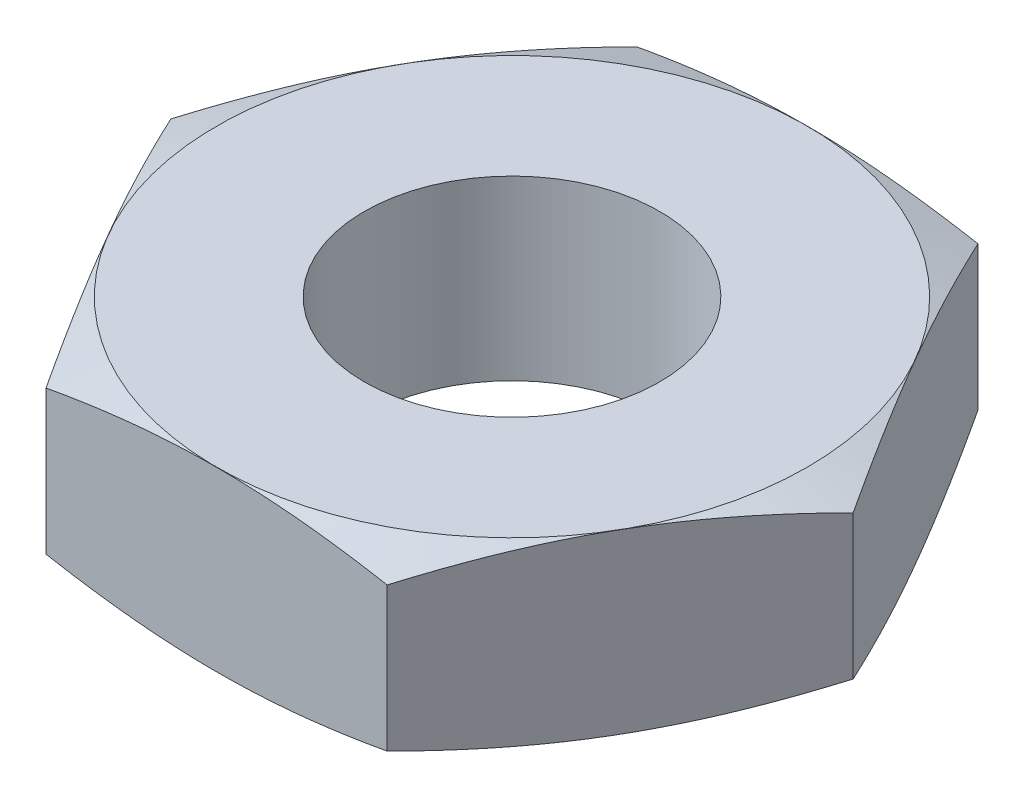
ISO-10303-21;
HEADER;
FILE_DESCRIPTION(('STEP AP214'),'2;1');
FILE_NAME('part.step','',(''),(''),'','','');
FILE_SCHEMA(('AUTOMOTIVE_DESIGN { 1 0 10303 214 1 1 1 1 }'));
ENDSEC;
DATA;
#1=APPLICATION_CONTEXT('core data for automotive mechanical design processes');
#2=APPLICATION_PROTOCOL_DEFINITION('international standard','automotive_design',2000,#1);
#3=PRODUCT_CONTEXT('',#1,'mechanical');
#4=PRODUCT('Part','Part','',(#3));
#5=PRODUCT_RELATED_PRODUCT_CATEGORY('part','',(#4));
#6=PRODUCT_DEFINITION_FORMATION('','',#4);
#7=PRODUCT_DEFINITION_CONTEXT('part definition',#1,'design');
#8=PRODUCT_DEFINITION('design','',#6,#7);
#9=PRODUCT_DEFINITION_SHAPE('','',#8);
#10=(LENGTH_UNIT() NAMED_UNIT(*) SI_UNIT(.MILLI.,.METRE.));
#11=(NAMED_UNIT(*) PLANE_ANGLE_UNIT() SI_UNIT($,.RADIAN.));
#12=(NAMED_UNIT(*) SI_UNIT($,.STERADIAN.) SOLID_ANGLE_UNIT());
#13=UNCERTAINTY_MEASURE_WITH_UNIT(LENGTH_MEASURE(1.E-05),#10,'distance_accuracy_value','');
#14=(GEOMETRIC_REPRESENTATION_CONTEXT(3) GLOBAL_UNCERTAINTY_ASSIGNED_CONTEXT((#13)) GLOBAL_UNIT_ASSIGNED_CONTEXT((#10,
#11,#12)) REPRESENTATION_CONTEXT('',''));
#15=CARTESIAN_POINT('',(0.,0.,0.));
#16=DIRECTION('',(0.,0.,1.));
#17=DIRECTION('',(1.,0.,0.));
#18=AXIS2_PLACEMENT_3D('',#15,#16,#17);
#19=CARTESIAN_POINT('',(0.,0.6,0.));
#20=DIRECTION('',(0.,1.,0.));
#21=DIRECTION('',(0.,0.,1.));
#22=AXIS2_PLACEMENT_3D('',#19,#20,#21);
#23=PLANE('',#22);
#24=CARTESIAN_POINT('',(0.,0.6,0.));
#25=DIRECTION('',(0.,1.,0.));
#26=DIRECTION('',(0.,0.,1.));
#27=AXIS2_PLACEMENT_3D('',#24,#25,#26);
#28=CIRCLE('',#27,1.);
#29=CARTESIAN_POINT('',(0.,0.6,1.));
#30=VERTEX_POINT('',#29);
#31=EDGE_CURVE('E191',#30,#30,#28,.T.);
#32=ORIENTED_EDGE('',*,*,#31,.F.);
#33=EDGE_LOOP('',(#32));
#34=FACE_BOUND('',#33,.T.);
#35=CARTESIAN_POINT('',(0.,0.6,0.));
#36=DIRECTION('',(0.,-1.,0.));
#37=DIRECTION('',(1.,0.,0.));
#38=AXIS2_PLACEMENT_3D('',#35,#36,#37);
#39=CIRCLE('',#38,1.9994010767585);
#40=CARTESIAN_POINT('',(1.9994010767585,0.6,0.));
#41=VERTEX_POINT('',#40);
#42=EDGE_CURVE('E212',#41,#41,#39,.T.);
#43=ORIENTED_EDGE('',*,*,#42,.F.);
#44=EDGE_LOOP('',(#43));
#45=FACE_BOUND('',#44,.T.);
#46=ADVANCED_FACE('F33',(#34,#45),#23,.T.);
#47=CARTESIAN_POINT('',(0.,-0.6,0.));
#48=DIRECTION('',(0.,1.,0.));
#49=DIRECTION('',(0.,0.,1.));
#50=AXIS2_PLACEMENT_3D('',#47,#48,#49);
#51=PLANE('',#50);
#52=CARTESIAN_POINT('',(0.,-0.6,0.));
#53=DIRECTION('',(0.,1.,0.));
#54=DIRECTION('',(0.,0.,1.));
#55=AXIS2_PLACEMENT_3D('',#52,#53,#54);
#56=CIRCLE('',#55,1.);
#57=CARTESIAN_POINT('',(0.,-0.6,1.));
#58=VERTEX_POINT('',#57);
#59=EDGE_CURVE('E190',#58,#58,#56,.T.);
#60=ORIENTED_EDGE('',*,*,#59,.T.);
#61=EDGE_LOOP('',(#60));
#62=FACE_BOUND('',#61,.T.);
#63=CARTESIAN_POINT('',(0.,-0.600000000000001,0.));
#64=DIRECTION('',(0.,-1.,0.));
#65=DIRECTION('',(1.,0.,0.));
#66=AXIS2_PLACEMENT_3D('',#63,#64,#65);
#67=CIRCLE('',#66,1.9994010767585);
#68=CARTESIAN_POINT('',(1.9994010767585,-0.600000000000001,0.));
#69=VERTEX_POINT('',#68);
#70=EDGE_CURVE('E215',#69,#69,#67,.T.);
#71=ORIENTED_EDGE('',*,*,#70,.T.);
#72=EDGE_LOOP('',(#71));
#73=FACE_BOUND('',#72,.T.);
#74=ADVANCED_FACE('F222',(#62,#73),#51,.F.);
#75=CARTESIAN_POINT('',(0.,0.6,0.));
#76=DIRECTION('',(0.,-1.,0.));
#77=DIRECTION('',(0.,0.,-1.));
#78=AXIS2_PLACEMENT_3D('',#75,#76,#77);
#79=CYLINDRICAL_SURFACE('',#78,1.);
#80=ORIENTED_EDGE('',*,*,#31,.T.);
#81=EDGE_LOOP('',(#80));
#82=FACE_BOUND('',#81,.T.);
#83=ORIENTED_EDGE('',*,*,#59,.F.);
#84=EDGE_LOOP('',(#83));
#85=FACE_BOUND('',#84,.T.);
#86=ADVANCED_FACE('F128',(#82,#85),#79,.F.);
#87=CARTESIAN_POINT('',(0.,-0.600000000000001,0.));
#88=DIRECTION('',(0.,1.,0.));
#89=DIRECTION('',(-1.,0.,0.));
#90=AXIS2_PLACEMENT_3D('',#87,#88,#89);
#91=CONICAL_SURFACE('',#90,1.9994010767585,1.22173047639604);
#92=ORIENTED_EDGE('',*,*,#70,.F.);
#93=EDGE_LOOP('',(#92));
#94=FACE_BOUND('',#93,.T.);
#95=CARTESIAN_POINT('',(2.30951654681234,-0.487127196563017,-0.00020000000000341));
#96=CARTESIAN_POINT('',(2.26168836191613,-0.504543559167057,0.0826408462740292));
#97=CARTESIAN_POINT('',(2.213702437291,-0.520386892866488,0.165754905772931));
#98=CARTESIAN_POINT('',(2.11741850917833,-0.548260956120586,0.332523561216387));
#99=CARTESIAN_POINT('',(2.06912029137895,-0.560288700830407,0.41617852835994));
#100=CARTESIAN_POINT('',(1.97274789994999,-0.579743294111881,0.583100406761805));
#101=CARTESIAN_POINT('',(1.92467592830622,-0.587212585445252,0.666363504068832));
#102=CARTESIAN_POINT('',(1.82841954097686,-0.597231020361229,0.833084457476312));
#103=CARTESIAN_POINT('',(1.78023517427287,-0.599782009767486,0.916542228738155));
#104=CARTESIAN_POINT('',(1.68386644086488,-0.599782009767486,1.08345777126184));
#105=CARTESIAN_POINT('',(1.63568207416089,-0.597231020361229,1.16691554252368));
#106=CARTESIAN_POINT('',(1.53942568683153,-0.587212585445252,1.33363649593116));
#107=CARTESIAN_POINT('',(1.49135371518776,-0.57974329411188,1.41689959323819));
#108=CARTESIAN_POINT('',(1.39498132375881,-0.560288700830407,1.58382147164006));
#109=CARTESIAN_POINT('',(1.34668310595943,-0.548260956120585,1.66747643878361));
#110=CARTESIAN_POINT('',(1.25039917784676,-0.520386892866488,1.83424509422707));
#111=CARTESIAN_POINT('',(1.20241325322162,-0.504543559167056,1.91735915372597));
#112=CARTESIAN_POINT('',(1.15458506832541,-0.487127196563017,2.0002));
#113=B_SPLINE_CURVE_WITH_KNOTS('',3,(#95,#96,#97,#98,#99,#100,#101,#102,#103,#104,#105,#106,
#107,#108,#109,#110,#111,#112),.UNSPECIFIED.,.F.,.F.,(4,2,2,2,2,2,2,2,4),(0.,0.291716985835479,
0.583661615412809,0.872844804843115,1.16191944356589,1.45099408228865,1.74017727171896,
2.03212190129629,2.32383888713177),.UNSPECIFIED.);
#114=CARTESIAN_POINT('',(2.3094010767585,-0.487169227377481,0.));
#115=VERTEX_POINT('',#114);
#116=CARTESIAN_POINT('',(1.15470053837925,-0.48716922737748,2.));
#117=VERTEX_POINT('',#116);
#118=EDGE_CURVE('E62',#115,#117,#113,.T.);
#119=ORIENTED_EDGE('',*,*,#118,.T.);
#120=CARTESIAN_POINT('',(3.46705626768987,0.129089886549738,2.));
#121=CARTESIAN_POINT('',(3.33013884554599,0.0859548917896651,2.));
#122=CARTESIAN_POINT('',(3.19304996881433,0.0433440823684922,2.));
#123=CARTESIAN_POINT('',(2.91836561650236,-0.0403259218189088,2.));
#124=CARTESIAN_POINT('',(2.78077003017304,-0.0813847521993045,2.));
#125=CARTESIAN_POINT('',(2.50293989343281,-0.162016803843045,2.));
#126=CARTESIAN_POINT('',(2.36269633792908,-0.201559209946393,2.));
#127=CARTESIAN_POINT('',(2.08140003417142,-0.277660490936854,2.));
#128=CARTESIAN_POINT('',(1.94034731693318,-0.314219479373179,2.));
#129=CARTESIAN_POINT('',(1.66324364687404,-0.381664102501102,2.));
#130=CARTESIAN_POINT('',(1.52723594652576,-0.41272520398333,2.));
#131=CARTESIAN_POINT('',(1.25407218618375,-0.469483257568481,2.));
#132=CARTESIAN_POINT('',(1.11691604976117,-0.495179849662369,2.));
#133=CARTESIAN_POINT('',(0.842472176170576,-0.539097359435634,2.));
#134=CARTESIAN_POINT('',(0.705193739633208,-0.55737480415698,2.));
#135=CARTESIAN_POINT('',(0.429720168506988,-0.584722819504035,2.));
#136=CARTESIAN_POINT('',(0.291525372840955,-0.59379662175013,2.));
#137=CARTESIAN_POINT('',(0.0779284525007091,-0.59974611879544,2.));
#138=CARTESIAN_POINT('',(0.00261695760709193,-0.60029666122611,2.));
#139=CARTESIAN_POINT('',(-0.147965758277367,-0.598306508523819,2.));
#140=CARTESIAN_POINT('',(-0.223236978738911,-0.595765773716477,2.));
#141=CARTESIAN_POINT('',(-0.448841700044504,-0.58363542280208,2.));
#142=CARTESIAN_POINT('',(-0.598944755271522,-0.569537100020046,2.));
#143=CARTESIAN_POINT('',(-0.899076036855468,-0.531279295709715,2.));
#144=CARTESIAN_POINT('',(-1.04909293533219,-0.507035887426858,2.));
#145=CARTESIAN_POINT('',(-1.34772186103745,-0.451170901378118,2.));
#146=CARTESIAN_POINT('',(-1.49633376856316,-0.419548700742286,2.));
#147=CARTESIAN_POINT('',(-1.79945714467584,-0.349483573797011,2.));
#148=CARTESIAN_POINT('',(-1.95390856215991,-0.310785736524934,2.));
#149=CARTESIAN_POINT('',(-2.26176733214314,-0.22949658984245,2.));
#150=CARTESIAN_POINT('',(-2.41517470355086,-0.186905351147568,2.));
#151=CARTESIAN_POINT('',(-2.71866034008922,-0.0997598798531306,2.));
#152=CARTESIAN_POINT('',(-2.86875149851782,-0.0552501542070376,2.));
#153=CARTESIAN_POINT('',(-3.16831402385208,0.0356674807842536,2.));
#154=CARTESIAN_POINT('',(-3.31778555079943,0.0820748613624075,2.));
#155=CARTESIAN_POINT('',(-3.46705626768987,0.129089886549739,2.));
#156=B_SPLINE_CURVE_WITH_KNOTS('',3,(#120,#121,#122,#123,#124,#125,#126,#127,#128,#129,#130,
#131,#132,#133,#134,#135,#136,#137,#138,#139,#140,#141,#142,#143,#144,#145,#146,#147,#148,#149,
#150,#151,#152,#153,#154,#155),.UNSPECIFIED.,.F.,.F.,(4,2,2,2,2,2,2,2,2,2,2,2,2,2,2,2,2,4),(0.,
0.430662284693181,0.861425063416365,1.29853673075301,1.73563175380379,2.15408469534232,
2.57256570998792,2.9877955748489,3.4028795919872,3.62876136808668,3.85464604325127,
4.30647973356047,4.76212758322337,5.21781390965536,5.69541820539945,6.1730138281794,
6.64265524446317,7.11216667877014),.UNSPECIFIED.);
#157=CARTESIAN_POINT('',(-1.15470053837925,-0.48716922737748,2.));
#158=VERTEX_POINT('',#157);
#159=EDGE_CURVE('E48',#117,#158,#156,.T.);
#160=ORIENTED_EDGE('',*,*,#159,.T.);
#161=CARTESIAN_POINT('',(-1.15458506832541,-0.487127196563017,2.0002));
#162=CARTESIAN_POINT('',(-1.20241325322162,-0.504543559167056,1.91735915372597));
#163=CARTESIAN_POINT('',(-1.25039917784675,-0.520386892866487,1.83424509422707));
#164=CARTESIAN_POINT('',(-1.34668310595942,-0.548260956120585,1.66747643878361));
#165=CARTESIAN_POINT('',(-1.3949813237588,-0.560288700830406,1.58382147164006));
#166=CARTESIAN_POINT('',(-1.49135371518776,-0.57974329411188,1.41689959323819));
#167=CARTESIAN_POINT('',(-1.53942568683153,-0.587212585445252,1.33363649593117));
#168=CARTESIAN_POINT('',(-1.63568207416089,-0.597231020361229,1.16691554252369));
#169=CARTESIAN_POINT('',(-1.68386644086488,-0.599782009767485,1.08345777126184));
#170=CARTESIAN_POINT('',(-1.78023517427287,-0.599782009767485,0.916542228738158));
#171=CARTESIAN_POINT('',(-1.82841954097686,-0.597231020361229,0.833084457476316));
#172=CARTESIAN_POINT('',(-1.92467592830622,-0.587212585445252,0.666363504068835));
#173=CARTESIAN_POINT('',(-1.97274789994999,-0.57974329411188,0.583100406761808));
#174=CARTESIAN_POINT('',(-2.06912029137895,-0.560288700830406,0.416178528359943));
#175=CARTESIAN_POINT('',(-2.11741850917833,-0.548260956120585,0.332523561216391));
#176=CARTESIAN_POINT('',(-2.213702437291,-0.520386892866487,0.165754905772936));
#177=CARTESIAN_POINT('',(-2.26168836191613,-0.504543559167056,0.082640846274034));
#178=CARTESIAN_POINT('',(-2.30951654681234,-0.487127196563017,-0.000199999999998725));
#179=B_SPLINE_CURVE_WITH_KNOTS('',3,(#161,#162,#163,#164,#165,#166,#167,#168,#169,#170,#171,
#172,#173,#174,#175,#176,#177,#178),.UNSPECIFIED.,.F.,.F.,(4,2,2,2,2,2,2,2,4),(0.,
0.291716985835479,0.583661615412808,0.872844804843114,1.16191944356588,1.45099408228865,
1.74017727171896,2.03212190129629,2.32383888713177),.UNSPECIFIED.);
#180=CARTESIAN_POINT('',(-2.3094010767585,-0.48716922737748,0.));
#181=VERTEX_POINT('',#180);
#182=EDGE_CURVE('E137',#158,#181,#179,.T.);
#183=ORIENTED_EDGE('',*,*,#182,.T.);
#184=CARTESIAN_POINT('',(-2.30951654681234,-0.487127196563017,0.000200000000001812));
#185=CARTESIAN_POINT('',(-2.26168836191613,-0.504543559167056,-0.0826408462740309));
#186=CARTESIAN_POINT('',(-2.213702437291,-0.520386892866488,-0.165754905772933));
#187=CARTESIAN_POINT('',(-2.11741850917833,-0.548260956120585,-0.332523561216388));
#188=CARTESIAN_POINT('',(-2.06912029137895,-0.560288700830407,-0.416178528359941));
#189=CARTESIAN_POINT('',(-1.97274789994999,-0.57974329411188,-0.583100406761806));
#190=CARTESIAN_POINT('',(-1.92467592830622,-0.587212585445252,-0.666363504068833));
#191=CARTESIAN_POINT('',(-1.82841954097686,-0.597231020361229,-0.833084457476314));
#192=CARTESIAN_POINT('',(-1.78023517427287,-0.599782009767486,-0.916542228738156));
#193=CARTESIAN_POINT('',(-1.68386644086488,-0.599782009767486,-1.08345777126184));
#194=CARTESIAN_POINT('',(-1.63568207416089,-0.597231020361229,-1.16691554252369));
#195=CARTESIAN_POINT('',(-1.53942568683153,-0.587212585445252,-1.33363649593117));
#196=CARTESIAN_POINT('',(-1.49135371518776,-0.57974329411188,-1.41689959323819));
#197=CARTESIAN_POINT('',(-1.3949813237588,-0.560288700830406,-1.58382147164006));
#198=CARTESIAN_POINT('',(-1.34668310595943,-0.548260956120585,-1.66747643878361));
#199=CARTESIAN_POINT('',(-1.25039917784675,-0.520386892866487,-1.83424509422707));
#200=CARTESIAN_POINT('',(-1.20241325322162,-0.504543559167056,-1.91735915372597));
#201=CARTESIAN_POINT('',(-1.15458506832541,-0.487127196563017,-2.0002));
#202=B_SPLINE_CURVE_WITH_KNOTS('',3,(#184,#185,#186,#187,#188,#189,#190,#191,#192,#193,#194,
#195,#196,#197,#198,#199,#200,#201),.UNSPECIFIED.,.F.,.F.,(4,2,2,2,2,2,2,2,4),(0.,
0.291716985835479,0.583661615412809,0.872844804843115,1.16191944356588,1.45099408228865,
1.74017727171896,2.03212190129629,2.32383888713177),.UNSPECIFIED.);
#203=CARTESIAN_POINT('',(-1.15470053837925,-0.48716922737748,-2.));
#204=VERTEX_POINT('',#203);
#205=EDGE_CURVE('E145',#181,#204,#202,.T.);
#206=ORIENTED_EDGE('',*,*,#205,.T.);
#207=CARTESIAN_POINT('',(-3.46705626768987,0.12908988654974,-2.));
#208=CARTESIAN_POINT('',(-3.33013884554599,0.0859548917896662,-2.));
#209=CARTESIAN_POINT('',(-3.19304996881433,0.0433440823684932,-2.));
#210=CARTESIAN_POINT('',(-2.91836561650236,-0.0403259218189079,-2.));
#211=CARTESIAN_POINT('',(-2.78077003017305,-0.0813847521993036,-2.));
#212=CARTESIAN_POINT('',(-2.50293989343281,-0.162016803843044,-2.));
#213=CARTESIAN_POINT('',(-2.36269633792908,-0.201559209946392,-2.));
#214=CARTESIAN_POINT('',(-2.08140003417142,-0.277660490936854,-2.));
#215=CARTESIAN_POINT('',(-1.94034731693318,-0.314219479373179,-2.));
#216=CARTESIAN_POINT('',(-1.66324364687404,-0.381664102501101,-2.));
#217=CARTESIAN_POINT('',(-1.52723594652576,-0.41272520398333,-2.));
#218=CARTESIAN_POINT('',(-1.25407218618375,-0.469483257568481,-2.));
#219=CARTESIAN_POINT('',(-1.11691604976117,-0.495179849662369,-2.));
#220=CARTESIAN_POINT('',(-0.842472176170575,-0.539097359435634,-2.));
#221=CARTESIAN_POINT('',(-0.705193739633208,-0.557374804156979,-2.));
#222=CARTESIAN_POINT('',(-0.429720168506987,-0.584722819504035,-2.));
#223=CARTESIAN_POINT('',(-0.291525372840954,-0.59379662175013,-2.));
#224=CARTESIAN_POINT('',(-0.0779284525007085,-0.59974611879544,-2.));
#225=CARTESIAN_POINT('',(-0.0026169576070914,-0.60029666122611,-2.));
#226=CARTESIAN_POINT('',(0.147965758277368,-0.598306508523819,-2.));
#227=CARTESIAN_POINT('',(0.223236978738912,-0.595765773716477,-2.));
#228=CARTESIAN_POINT('',(0.448841700044505,-0.58363542280208,-2.));
#229=CARTESIAN_POINT('',(0.598944755271523,-0.569537100020046,-2.));
#230=CARTESIAN_POINT('',(0.899076036855469,-0.531279295709715,-2.));
#231=CARTESIAN_POINT('',(1.04909293533219,-0.507035887426858,-2.));
#232=CARTESIAN_POINT('',(1.34772186103745,-0.451170901378119,-2.));
#233=CARTESIAN_POINT('',(1.49633376856316,-0.419548700742286,-2.));
#234=CARTESIAN_POINT('',(1.79945714467585,-0.349483573797011,-2.));
#235=CARTESIAN_POINT('',(1.95390856215992,-0.310785736524934,-2.));
#236=CARTESIAN_POINT('',(2.26176733214314,-0.22949658984245,-2.));
#237=CARTESIAN_POINT('',(2.41517470355086,-0.186905351147568,-2.));
#238=CARTESIAN_POINT('',(2.71866034008922,-0.0997598798531305,-2.));
#239=CARTESIAN_POINT('',(2.86875149851782,-0.0552501542070375,-2.));
#240=CARTESIAN_POINT('',(3.16831402385208,0.0356674807842535,-2.));
#241=CARTESIAN_POINT('',(3.31778555079943,0.0820748613624073,-2.));
#242=CARTESIAN_POINT('',(3.46705626768987,0.129089886549739,-2.));
#243=B_SPLINE_CURVE_WITH_KNOTS('',3,(#207,#208,#209,#210,#211,#212,#213,#214,#215,#216,#217,
#218,#219,#220,#221,#222,#223,#224,#225,#226,#227,#228,#229,#230,#231,#232,#233,#234,#235,#236,
#237,#238,#239,#240,#241,#242),.UNSPECIFIED.,.F.,.F.,(4,2,2,2,2,2,2,2,2,2,2,2,2,2,2,2,2,4),(0.,
0.430662284693181,0.861425063416365,1.29853673075301,1.73563175380379,2.15408469534232,
2.57256570998792,2.98779557484891,3.4028795919872,3.62876136808668,3.85464604325127,
4.30647973356047,4.76212758322337,5.21781390965536,5.69541820539945,6.17301382817941,
6.64265524446317,7.11216667877015),.UNSPECIFIED.);
#244=CARTESIAN_POINT('',(1.15470053837925,-0.487169227377481,-2.));
#245=VERTEX_POINT('',#244);
#246=EDGE_CURVE('E93',#204,#245,#243,.T.);
#247=ORIENTED_EDGE('',*,*,#246,.T.);
#248=CARTESIAN_POINT('',(1.15458506832541,-0.487127196563017,-2.0002));
#249=CARTESIAN_POINT('',(1.20241325322162,-0.504543559167056,-1.91735915372597));
#250=CARTESIAN_POINT('',(1.25039917784676,-0.520386892866487,-1.83424509422707));
#251=CARTESIAN_POINT('',(1.34668310595943,-0.548260956120585,-1.66747643878361));
#252=CARTESIAN_POINT('',(1.39498132375881,-0.560288700830406,-1.58382147164006));
#253=CARTESIAN_POINT('',(1.49135371518776,-0.57974329411188,-1.41689959323819));
#254=CARTESIAN_POINT('',(1.53942568683153,-0.587212585445252,-1.33363649593117));
#255=CARTESIAN_POINT('',(1.63568207416089,-0.597231020361229,-1.16691554252369));
#256=CARTESIAN_POINT('',(1.68386644086489,-0.599782009767485,-1.08345777126184));
#257=CARTESIAN_POINT('',(1.78023517427287,-0.599782009767485,-0.916542228738159));
#258=CARTESIAN_POINT('',(1.82841954097686,-0.597231020361229,-0.833084457476317));
#259=CARTESIAN_POINT('',(1.92467592830622,-0.587212585445252,-0.666363504068836));
#260=CARTESIAN_POINT('',(1.97274789994999,-0.57974329411188,-0.583100406761809));
#261=CARTESIAN_POINT('',(2.06912029137895,-0.560288700830406,-0.416178528359945));
#262=CARTESIAN_POINT('',(2.11741850917833,-0.548260956120585,-0.332523561216392));
#263=CARTESIAN_POINT('',(2.213702437291,-0.520386892866488,-0.165754905772937));
#264=CARTESIAN_POINT('',(2.26168836191613,-0.504543559167057,-0.0826408462740355));
#265=CARTESIAN_POINT('',(2.30951654681234,-0.487127196563017,0.000199999999997005));
#266=B_SPLINE_CURVE_WITH_KNOTS('',3,(#248,#249,#250,#251,#252,#253,#254,#255,#256,#257,#258,
#259,#260,#261,#262,#263,#264,#265),.UNSPECIFIED.,.F.,.F.,(4,2,2,2,2,2,2,2,4),(0.,
0.291716985835478,0.583661615412808,0.872844804843113,1.16191944356588,1.45099408228865,
1.74017727171896,2.03212190129629,2.32383888713177),.UNSPECIFIED.);
#267=EDGE_CURVE('E90',#245,#115,#266,.T.);
#268=ORIENTED_EDGE('',*,*,#267,.T.);
#269=EDGE_LOOP('',(#119,#160,#183,#206,#247,#268));
#270=FACE_BOUND('',#269,.T.);
#271=ADVANCED_FACE('F91',(#94,#270),#91,.T.);
#272=CARTESIAN_POINT('',(0.,0.487169227377479,0.));
#273=DIRECTION('',(0.,-1.,0.));
#274=DIRECTION('',(1.,0.,0.));
#275=AXIS2_PLACEMENT_3D('',#272,#273,#274);
#276=CONICAL_SURFACE('',#275,2.3094010767585,1.22173047639604);
#277=ORIENTED_EDGE('',*,*,#42,.T.);
#278=EDGE_LOOP('',(#277));
#279=FACE_BOUND('',#278,.T.);
#280=CARTESIAN_POINT('',(1.15458506832541,0.487127196563016,2.0002));
#281=CARTESIAN_POINT('',(1.20241325322162,0.504543559167055,1.91735915372597));
#282=CARTESIAN_POINT('',(1.25039917784676,0.520386892866486,1.83424509422707));
#283=CARTESIAN_POINT('',(1.34668310595943,0.548260956120584,1.66747643878361));
#284=CARTESIAN_POINT('',(1.39498132375881,0.560288700830405,1.58382147164006));
#285=CARTESIAN_POINT('',(1.49135371518776,0.579743294111879,1.41689959323819));
#286=CARTESIAN_POINT('',(1.53942568683153,0.587212585445251,1.33363649593117));
#287=CARTESIAN_POINT('',(1.63568207416089,0.597231020361228,1.16691554252368));
#288=CARTESIAN_POINT('',(1.68386644086488,0.599782009767485,1.08345777126184));
#289=CARTESIAN_POINT('',(1.78023517427287,0.599782009767485,0.916542228738156));
#290=CARTESIAN_POINT('',(1.82841954097686,0.597231020361228,0.833084457476313));
#291=CARTESIAN_POINT('',(1.92467592830622,0.587212585445251,0.666363504068832));
#292=CARTESIAN_POINT('',(1.97274789994999,0.579743294111879,0.583100406761805));
#293=CARTESIAN_POINT('',(2.06912029137895,0.560288700830406,0.41617852835994));
#294=CARTESIAN_POINT('',(2.11741850917833,0.548260956120584,0.332523561216387));
#295=CARTESIAN_POINT('',(2.213702437291,0.520386892866487,0.165754905772931));
#296=CARTESIAN_POINT('',(2.26168836191613,0.504543559167055,0.0826408462740293));
#297=CARTESIAN_POINT('',(2.30951654681234,0.487127196563016,-0.000200000000003295));
#298=B_SPLINE_CURVE_WITH_KNOTS('',3,(#280,#281,#282,#283,#284,#285,#286,#287,#288,#289,#290,
#291,#292,#293,#294,#295,#296,#297),.UNSPECIFIED.,.F.,.F.,(4,2,2,2,2,2,2,2,4),(0.,
0.291716985835479,0.583661615412809,0.872844804843115,1.16191944356589,1.45099408228865,
1.74017727171896,2.03212190129629,2.32383888713177),.UNSPECIFIED.);
#299=CARTESIAN_POINT('',(1.15470053837925,0.487169227377479,2.));
#300=VERTEX_POINT('',#299);
#301=CARTESIAN_POINT('',(2.3094010767585,0.487169227377479,0.));
#302=VERTEX_POINT('',#301);
#303=EDGE_CURVE('E178',#300,#302,#298,.T.);
#304=ORIENTED_EDGE('',*,*,#303,.T.);
#305=CARTESIAN_POINT('',(2.30951654681234,0.487127196563016,0.000199999999996647));
#306=CARTESIAN_POINT('',(2.26168836191613,0.504543559167055,-0.0826408462740359));
#307=CARTESIAN_POINT('',(2.213702437291,0.520386892866486,-0.165754905772938));
#308=CARTESIAN_POINT('',(2.11741850917833,0.548260956120584,-0.332523561216392));
#309=CARTESIAN_POINT('',(2.06912029137895,0.560288700830405,-0.416178528359945));
#310=CARTESIAN_POINT('',(1.97274789994999,0.579743294111879,-0.58310040676181));
#311=CARTESIAN_POINT('',(1.92467592830622,0.587212585445251,-0.666363504068837));
#312=CARTESIAN_POINT('',(1.82841954097686,0.597231020361227,-0.833084457476317));
#313=CARTESIAN_POINT('',(1.78023517427287,0.599782009767484,-0.91654222873816));
#314=CARTESIAN_POINT('',(1.68386644086489,0.599782009767484,-1.08345777126184));
#315=CARTESIAN_POINT('',(1.63568207416089,0.597231020361227,-1.16691554252369));
#316=CARTESIAN_POINT('',(1.53942568683153,0.58721258544525,-1.33363649593117));
#317=CARTESIAN_POINT('',(1.49135371518776,0.579743294111879,-1.41689959323819));
#318=CARTESIAN_POINT('',(1.39498132375881,0.560288700830405,-1.58382147164006));
#319=CARTESIAN_POINT('',(1.34668310595943,0.548260956120584,-1.66747643878361));
#320=CARTESIAN_POINT('',(1.25039917784676,0.520386892866486,-1.83424509422707));
#321=CARTESIAN_POINT('',(1.20241325322162,0.504543559167055,-1.91735915372597));
#322=CARTESIAN_POINT('',(1.15458506832541,0.487127196563015,-2.0002));
#323=B_SPLINE_CURVE_WITH_KNOTS('',3,(#305,#306,#307,#308,#309,#310,#311,#312,#313,#314,#315,
#316,#317,#318,#319,#320,#321,#322),.UNSPECIFIED.,.F.,.F.,(4,2,2,2,2,2,2,2,4),(0.,
0.291716985835478,0.583661615412808,0.872844804843114,1.16191944356588,1.45099408228865,
1.74017727171896,2.03212190129629,2.32383888713177),.UNSPECIFIED.);
#324=CARTESIAN_POINT('',(1.15470053837925,0.487169227377479,-2.));
#325=VERTEX_POINT('',#324);
#326=EDGE_CURVE('E109',#302,#325,#323,.T.);
#327=ORIENTED_EDGE('',*,*,#326,.T.);
#328=CARTESIAN_POINT('',(3.46705626768987,-0.129089886549742,-2.));
#329=CARTESIAN_POINT('',(3.33013884554599,-0.0859548917896685,-2.));
#330=CARTESIAN_POINT('',(3.19304996881433,-0.0433440823684955,-2.));
#331=CARTESIAN_POINT('',(2.91836561650236,0.0403259218189058,-2.));
#332=CARTESIAN_POINT('',(2.78077003017305,0.0813847521993016,-2.));
#333=CARTESIAN_POINT('',(2.50293989343281,0.162016803843042,-2.));
#334=CARTESIAN_POINT('',(2.36269633792908,0.20155920994639,-2.));
#335=CARTESIAN_POINT('',(2.08140003417142,0.277660490936852,-2.));
#336=CARTESIAN_POINT('',(1.94034731693319,0.314219479373177,-2.));
#337=CARTESIAN_POINT('',(1.66324364687404,0.3816641025011,-2.));
#338=CARTESIAN_POINT('',(1.52723594652577,0.412725203983328,-2.));
#339=CARTESIAN_POINT('',(1.25407218618375,0.469483257568479,-2.));
#340=CARTESIAN_POINT('',(1.11691604976117,0.495179849662367,-2.));
#341=CARTESIAN_POINT('',(0.84247217617058,0.539097359435632,-2.));
#342=CARTESIAN_POINT('',(0.705193739633212,0.557374804156978,-2.));
#343=CARTESIAN_POINT('',(0.429720168506992,0.584722819504034,-2.));
#344=CARTESIAN_POINT('',(0.291525372840959,0.593796621750129,-2.));
#345=CARTESIAN_POINT('',(0.0779284525007136,0.599746118795439,-2.));
#346=CARTESIAN_POINT('',(0.00261695760709626,0.600296661226109,-2.));
#347=CARTESIAN_POINT('',(-0.147965758277363,0.598306508523818,-2.));
#348=CARTESIAN_POINT('',(-0.223236978738907,0.595765773716476,-2.));
#349=CARTESIAN_POINT('',(-0.448841700044501,0.583635422802079,-2.));
#350=CARTESIAN_POINT('',(-0.598944755271519,0.569537100020046,-2.));
#351=CARTESIAN_POINT('',(-0.899076036855466,0.531279295709715,-2.));
#352=CARTESIAN_POINT('',(-1.04909293533219,0.507035887426858,-2.));
#353=CARTESIAN_POINT('',(-1.34772186103745,0.451170901378118,-2.));
#354=CARTESIAN_POINT('',(-1.49633376856316,0.419548700742285,-2.));
#355=CARTESIAN_POINT('',(-1.79945714467585,0.34948357379701,-2.));
#356=CARTESIAN_POINT('',(-1.95390856215992,0.310785736524933,-2.));
#357=CARTESIAN_POINT('',(-2.26176733214314,0.229496589842449,-2.));
#358=CARTESIAN_POINT('',(-2.41517470355086,0.186905351147567,-2.));
#359=CARTESIAN_POINT('',(-2.71866034008922,0.0997598798531293,-2.));
#360=CARTESIAN_POINT('',(-2.86875149851782,0.0552501542070362,-2.));
#361=CARTESIAN_POINT('',(-3.16831402385208,-0.0356674807842552,-2.));
#362=CARTESIAN_POINT('',(-3.31778555079943,-0.0820748613624091,-2.));
#363=CARTESIAN_POINT('',(-3.46705626768987,-0.129089886549741,-2.));
#364=B_SPLINE_CURVE_WITH_KNOTS('',3,(#328,#329,#330,#331,#332,#333,#334,#335,#336,#337,#338,
#339,#340,#341,#342,#343,#344,#345,#346,#347,#348,#349,#350,#351,#352,#353,#354,#355,#356,#357,
#358,#359,#360,#361,#362,#363),.UNSPECIFIED.,.F.,.F.,(4,2,2,2,2,2,2,2,2,2,2,2,2,2,2,2,2,4),(0.,
0.43066228469318,0.861425063416364,1.29853673075301,1.73563175380379,2.15408469534232,
2.57256570998792,2.9877955748489,3.4028795919872,3.62876136808667,3.85464604325127,
4.30647973356047,4.76212758322337,5.21781390965536,5.69541820539945,6.17301382817941,
6.64265524446317,7.11216667877015),.UNSPECIFIED.);
#365=CARTESIAN_POINT('',(-1.15470053837925,0.48716922737748,-2.));
#366=VERTEX_POINT('',#365);
#367=EDGE_CURVE('E179',#325,#366,#364,.T.);
#368=ORIENTED_EDGE('',*,*,#367,.T.);
#369=CARTESIAN_POINT('',(-1.15458506832541,0.487127196563016,-2.0002));
#370=CARTESIAN_POINT('',(-1.20241325322162,0.504543559167055,-1.91735915372597));
#371=CARTESIAN_POINT('',(-1.25039917784675,0.520386892866487,-1.83424509422707));
#372=CARTESIAN_POINT('',(-1.34668310595943,0.548260956120584,-1.66747643878361));
#373=CARTESIAN_POINT('',(-1.3949813237588,0.560288700830406,-1.58382147164006));
#374=CARTESIAN_POINT('',(-1.49135371518776,0.579743294111879,-1.41689959323819));
#375=CARTESIAN_POINT('',(-1.53942568683153,0.587212585445251,-1.33363649593117));
#376=CARTESIAN_POINT('',(-1.63568207416089,0.597231020361228,-1.16691554252368));
#377=CARTESIAN_POINT('',(-1.68386644086488,0.599782009767485,-1.08345777126184));
#378=CARTESIAN_POINT('',(-1.78023517427287,0.599782009767485,-0.916542228738156));
#379=CARTESIAN_POINT('',(-1.82841954097686,0.597231020361228,-0.833084457476313));
#380=CARTESIAN_POINT('',(-1.92467592830622,0.587212585445251,-0.666363504068833));
#381=CARTESIAN_POINT('',(-1.97274789994999,0.57974329411188,-0.583100406761805));
#382=CARTESIAN_POINT('',(-2.06912029137895,0.560288700830406,-0.41617852835994));
#383=CARTESIAN_POINT('',(-2.11741850917833,0.548260956120585,-0.332523561216388));
#384=CARTESIAN_POINT('',(-2.213702437291,0.520386892866487,-0.165754905772932));
#385=CARTESIAN_POINT('',(-2.26168836191613,0.504543559167056,-0.0826408462740303));
#386=CARTESIAN_POINT('',(-2.30951654681234,0.487127196563016,0.000200000000002336));
#387=B_SPLINE_CURVE_WITH_KNOTS('',3,(#369,#370,#371,#372,#373,#374,#375,#376,#377,#378,#379,
#380,#381,#382,#383,#384,#385,#386),.UNSPECIFIED.,.F.,.F.,(4,2,2,2,2,2,2,2,4),(0.,
0.291716985835479,0.583661615412808,0.872844804843115,1.16191944356588,1.45099408228865,
1.74017727171896,2.03212190129629,2.32383888713177),.UNSPECIFIED.);
#388=CARTESIAN_POINT('',(-2.3094010767585,0.48716922737748,0.));
#389=VERTEX_POINT('',#388);
#390=EDGE_CURVE('E209',#366,#389,#387,.T.);
#391=ORIENTED_EDGE('',*,*,#390,.T.);
#392=CARTESIAN_POINT('',(-2.30951654681234,0.487127196563016,-0.000199999999998238));
#393=CARTESIAN_POINT('',(-2.26168836191613,0.504543559167056,0.0826408462740343));
#394=CARTESIAN_POINT('',(-2.213702437291,0.520386892866487,0.165754905772936));
#395=CARTESIAN_POINT('',(-2.11741850917833,0.548260956120585,0.332523561216391));
#396=CARTESIAN_POINT('',(-2.06912029137895,0.560288700830406,0.416178528359944));
#397=CARTESIAN_POINT('',(-1.97274789994999,0.57974329411188,0.583100406761808));
#398=CARTESIAN_POINT('',(-1.92467592830622,0.587212585445251,0.666363504068836));
#399=CARTESIAN_POINT('',(-1.82841954097686,0.597231020361228,0.833084457476316));
#400=CARTESIAN_POINT('',(-1.78023517427287,0.599782009767485,0.916542228738159));
#401=CARTESIAN_POINT('',(-1.68386644086488,0.599782009767485,1.08345777126184));
#402=CARTESIAN_POINT('',(-1.63568207416089,0.597231020361228,1.16691554252369));
#403=CARTESIAN_POINT('',(-1.53942568683153,0.587212585445251,1.33363649593117));
#404=CARTESIAN_POINT('',(-1.49135371518776,0.579743294111879,1.41689959323819));
#405=CARTESIAN_POINT('',(-1.3949813237588,0.560288700830405,1.58382147164006));
#406=CARTESIAN_POINT('',(-1.34668310595942,0.548260956120584,1.66747643878361));
#407=CARTESIAN_POINT('',(-1.25039917784675,0.520386892866486,1.83424509422707));
#408=CARTESIAN_POINT('',(-1.20241325322162,0.504543559167055,1.91735915372597));
#409=CARTESIAN_POINT('',(-1.15458506832541,0.487127196563016,2.0002));
#410=B_SPLINE_CURVE_WITH_KNOTS('',3,(#392,#393,#394,#395,#396,#397,#398,#399,#400,#401,#402,
#403,#404,#405,#406,#407,#408,#409),.UNSPECIFIED.,.F.,.F.,(4,2,2,2,2,2,2,2,4),(0.,
0.291716985835478,0.583661615412808,0.872844804843114,1.16191944356588,1.45099408228865,
1.74017727171896,2.03212190129629,2.32383888713177),.UNSPECIFIED.);
#411=CARTESIAN_POINT('',(-1.15470053837925,0.487169227377479,2.));
#412=VERTEX_POINT('',#411);
#413=EDGE_CURVE('E54',#389,#412,#410,.T.);
#414=ORIENTED_EDGE('',*,*,#413,.T.);
#415=CARTESIAN_POINT('',(-3.46705626768987,-0.12908988654974,2.));
#416=CARTESIAN_POINT('',(-3.33013884554599,-0.0859548917896672,2.));
#417=CARTESIAN_POINT('',(-3.19304996881433,-0.0433440823684943,2.));
#418=CARTESIAN_POINT('',(-2.91836561650236,0.0403259218189067,2.));
#419=CARTESIAN_POINT('',(-2.78077003017304,0.0813847521993025,2.));
#420=CARTESIAN_POINT('',(-2.50293989343281,0.162016803843043,2.));
#421=CARTESIAN_POINT('',(-2.36269633792908,0.201559209946391,2.));
#422=CARTESIAN_POINT('',(-2.08140003417142,0.277660490936853,2.));
#423=CARTESIAN_POINT('',(-1.94034731693318,0.314219479373178,2.));
#424=CARTESIAN_POINT('',(-1.66324364687404,0.3816641025011,2.));
#425=CARTESIAN_POINT('',(-1.52723594652576,0.412725203983329,2.));
#426=CARTESIAN_POINT('',(-1.25407218618375,0.469483257568479,2.));
#427=CARTESIAN_POINT('',(-1.11691604976117,0.495179849662367,2.));
#428=CARTESIAN_POINT('',(-0.842472176170577,0.539097359435632,2.));
#429=CARTESIAN_POINT('',(-0.70519373963321,0.557374804156978,2.));
#430=CARTESIAN_POINT('',(-0.429720168506989,0.584722819504034,2.));
#431=CARTESIAN_POINT('',(-0.291525372840957,0.593796621750129,2.));
#432=CARTESIAN_POINT('',(-0.0779284525007115,0.599746118795439,2.));
#433=CARTESIAN_POINT('',(-0.00261695760709428,0.600296661226109,2.));
#434=CARTESIAN_POINT('',(0.147965758277365,0.598306508523818,2.));
#435=CARTESIAN_POINT('',(0.223236978738909,0.595765773716476,2.));
#436=CARTESIAN_POINT('',(0.448841700044503,0.583635422802079,2.));
#437=CARTESIAN_POINT('',(0.598944755271521,0.569537100020046,2.));
#438=CARTESIAN_POINT('',(0.899076036855467,0.531279295709714,2.));
#439=CARTESIAN_POINT('',(1.04909293533219,0.507035887426857,2.));
#440=CARTESIAN_POINT('',(1.34772186103745,0.451170901378118,2.));
#441=CARTESIAN_POINT('',(1.49633376856316,0.419548700742285,2.));
#442=CARTESIAN_POINT('',(1.79945714467585,0.34948357379701,2.));
#443=CARTESIAN_POINT('',(1.95390856215992,0.310785736524933,2.));
#444=CARTESIAN_POINT('',(2.26176733214314,0.229496589842449,2.));
#445=CARTESIAN_POINT('',(2.41517470355086,0.186905351147566,2.));
#446=CARTESIAN_POINT('',(2.71866034008922,0.099759879853129,2.));
#447=CARTESIAN_POINT('',(2.86875149851782,0.0552501542070359,2.));
#448=CARTESIAN_POINT('',(3.16831402385208,-0.0356674807842555,2.));
#449=CARTESIAN_POINT('',(3.31778555079943,-0.0820748613624095,2.));
#450=CARTESIAN_POINT('',(3.46705626768987,-0.129089886549741,2.));
#451=B_SPLINE_CURVE_WITH_KNOTS('',3,(#415,#416,#417,#418,#419,#420,#421,#422,#423,#424,#425,
#426,#427,#428,#429,#430,#431,#432,#433,#434,#435,#436,#437,#438,#439,#440,#441,#442,#443,#444,
#445,#446,#447,#448,#449,#450),.UNSPECIFIED.,.F.,.F.,(4,2,2,2,2,2,2,2,2,2,2,2,2,2,2,2,2,4),(0.,
0.43066228469318,0.861425063416364,1.29853673075301,1.73563175380379,2.15408469534232,
2.57256570998792,2.9877955748489,3.4028795919872,3.62876136808667,3.85464604325127,
4.30647973356047,4.76212758322337,5.21781390965536,5.69541820539945,6.1730138281794,
6.64265524446317,7.11216667877014),.UNSPECIFIED.);
#452=EDGE_CURVE('E11',#412,#300,#451,.T.);
#453=ORIENTED_EDGE('',*,*,#452,.T.);
#454=EDGE_LOOP('',(#304,#327,#368,#391,#414,#453));
#455=FACE_BOUND('',#454,.T.);
#456=ADVANCED_FACE('F127',(#279,#455),#276,.T.);
#457=CARTESIAN_POINT('',(-1.15470053837925,0.6,2.));
#458=DIRECTION('',(0.,0.,-1.));
#459=DIRECTION('',(-1.,0.,0.));
#460=AXIS2_PLACEMENT_3D('',#457,#458,#459);
#461=PLANE('',#460);
#462=ORIENTED_EDGE('',*,*,#452,.F.);
#463=DIRECTION('',(0.,-1.,0.));
#464=VECTOR('',#463,1.);
#465=CARTESIAN_POINT('',(-1.15470053837925,0.6,2.));
#466=LINE('',#465,#464);
#467=EDGE_CURVE('E197',#412,#158,#466,.T.);
#468=ORIENTED_EDGE('',*,*,#467,.T.);
#469=ORIENTED_EDGE('',*,*,#159,.F.);
#470=DIRECTION('',(0.,-1.,0.));
#471=VECTOR('',#470,1.);
#472=CARTESIAN_POINT('',(1.15470053837925,0.6,2.));
#473=LINE('',#472,#471);
#474=EDGE_CURVE('E105',#300,#117,#473,.T.);
#475=ORIENTED_EDGE('',*,*,#474,.F.);
#476=EDGE_LOOP('',(#462,#468,#469,#475));
#477=FACE_BOUND('',#476,.T.);
#478=ADVANCED_FACE('F120',(#477),#461,.F.);
#479=CARTESIAN_POINT('',(-2.3094010767585,0.6,0.));
#480=DIRECTION('',(0.866025403784438,0.,-0.5));
#481=DIRECTION('',(-0.5,0.,-0.866025403784439));
#482=AXIS2_PLACEMENT_3D('',#479,#480,#481);
#483=PLANE('',#482);
#484=ORIENTED_EDGE('',*,*,#413,.F.);
#485=DIRECTION('',(0.,-1.,0.));
#486=VECTOR('',#485,1.);
#487=CARTESIAN_POINT('',(-2.3094010767585,0.6,0.));
#488=LINE('',#487,#486);
#489=EDGE_CURVE('E200',#389,#181,#488,.T.);
#490=ORIENTED_EDGE('',*,*,#489,.T.);
#491=ORIENTED_EDGE('',*,*,#182,.F.);
#492=ORIENTED_EDGE('',*,*,#467,.F.);
#493=EDGE_LOOP('',(#484,#490,#491,#492));
#494=FACE_BOUND('',#493,.T.);
#495=ADVANCED_FACE('F267',(#494),#483,.F.);
#496=CARTESIAN_POINT('',(-1.15470053837925,0.6,-2.));
#497=DIRECTION('',(0.866025403784439,0.,0.5));
#498=DIRECTION('',(0.5,0.,-0.866025403784439));
#499=AXIS2_PLACEMENT_3D('',#496,#497,#498);
#500=PLANE('',#499);
#501=ORIENTED_EDGE('',*,*,#390,.F.);
#502=DIRECTION('',(0.,-1.,0.));
#503=VECTOR('',#502,1.);
#504=CARTESIAN_POINT('',(-1.15470053837925,0.6,-2.));
#505=LINE('',#504,#503);
#506=EDGE_CURVE('E112',#366,#204,#505,.T.);
#507=ORIENTED_EDGE('',*,*,#506,.T.);
#508=ORIENTED_EDGE('',*,*,#205,.F.);
#509=ORIENTED_EDGE('',*,*,#489,.F.);
#510=EDGE_LOOP('',(#501,#507,#508,#509));
#511=FACE_BOUND('',#510,.T.);
#512=ADVANCED_FACE('F207',(#511),#500,.F.);
#513=CARTESIAN_POINT('',(1.15470053837925,0.6,-2.));
#514=DIRECTION('',(0.,0.,1.));
#515=DIRECTION('',(1.,0.,0.));
#516=AXIS2_PLACEMENT_3D('',#513,#514,#515);
#517=PLANE('',#516);
#518=ORIENTED_EDGE('',*,*,#367,.F.);
#519=DIRECTION('',(0.,-1.,0.));
#520=VECTOR('',#519,1.);
#521=CARTESIAN_POINT('',(1.15470053837925,0.6,-2.));
#522=LINE('',#521,#520);
#523=EDGE_CURVE('E110',#325,#245,#522,.T.);
#524=ORIENTED_EDGE('',*,*,#523,.T.);
#525=ORIENTED_EDGE('',*,*,#246,.F.);
#526=ORIENTED_EDGE('',*,*,#506,.F.);
#527=EDGE_LOOP('',(#518,#524,#525,#526));
#528=FACE_BOUND('',#527,.T.);
#529=ADVANCED_FACE('F168',(#528),#517,.F.);
#530=CARTESIAN_POINT('',(2.3094010767585,0.6,0.));
#531=DIRECTION('',(-0.866025403784438,0.,0.5));
#532=DIRECTION('',(0.5,0.,0.866025403784438));
#533=AXIS2_PLACEMENT_3D('',#530,#531,#532);
#534=PLANE('',#533);
#535=ORIENTED_EDGE('',*,*,#326,.F.);
#536=DIRECTION('',(0.,-1.,0.));
#537=VECTOR('',#536,1.);
#538=CARTESIAN_POINT('',(2.3094010767585,0.6,0.));
#539=LINE('',#538,#537);
#540=EDGE_CURVE('E103',#302,#115,#539,.T.);
#541=ORIENTED_EDGE('',*,*,#540,.T.);
#542=ORIENTED_EDGE('',*,*,#267,.F.);
#543=ORIENTED_EDGE('',*,*,#523,.F.);
#544=EDGE_LOOP('',(#535,#541,#542,#543));
#545=FACE_BOUND('',#544,.T.);
#546=ADVANCED_FACE('F108',(#545),#534,.F.);
#547=CARTESIAN_POINT('',(1.15470053837925,0.6,2.));
#548=DIRECTION('',(-0.866025403784439,0.,-0.499999999999999));
#549=DIRECTION('',(-0.499999999999999,0.,0.866025403784439));
#550=AXIS2_PLACEMENT_3D('',#547,#548,#549);
#551=PLANE('',#550);
#552=ORIENTED_EDGE('',*,*,#303,.F.);
#553=ORIENTED_EDGE('',*,*,#474,.T.);
#554=ORIENTED_EDGE('',*,*,#118,.F.);
#555=ORIENTED_EDGE('',*,*,#540,.F.);
#556=EDGE_LOOP('',(#552,#553,#554,#555));
#557=FACE_BOUND('',#556,.T.);
#558=ADVANCED_FACE('F35',(#557),#551,.F.);
#559=CLOSED_SHELL('',(#46,#74,#86,#271,#456,#478,#495,#512,#529,#546,#558));
#560=MANIFOLD_SOLID_BREP('B2',#559);
#561=ADVANCED_BREP_SHAPE_REPRESENTATION('',(#18,#560),#14);
#562=SHAPE_DEFINITION_REPRESENTATION(#9,#561);
ENDSEC;
END-ISO-10303-21;
